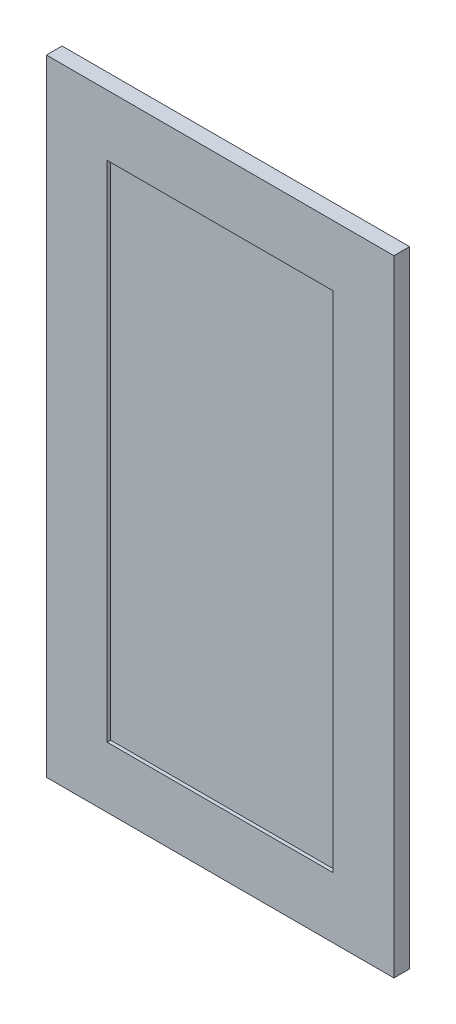
ISO-10303-21;
HEADER;
FILE_DESCRIPTION(('STEP AP214'),'2;1');
FILE_NAME('part.step','',(''),(''),'','','');
FILE_SCHEMA(('AUTOMOTIVE_DESIGN { 1 0 10303 214 1 1 1 1 }'));
ENDSEC;
DATA;
#1=APPLICATION_CONTEXT('core data for automotive mechanical design processes');
#2=APPLICATION_PROTOCOL_DEFINITION('international standard','automotive_design',2000,#1);
#3=PRODUCT_CONTEXT('',#1,'mechanical');
#4=PRODUCT('Part','Part','',(#3));
#5=PRODUCT_RELATED_PRODUCT_CATEGORY('part','',(#4));
#6=PRODUCT_DEFINITION_FORMATION('','',#4);
#7=PRODUCT_DEFINITION_CONTEXT('part definition',#1,'design');
#8=PRODUCT_DEFINITION('design','',#6,#7);
#9=PRODUCT_DEFINITION_SHAPE('','',#8);
#10=(LENGTH_UNIT() NAMED_UNIT(*) SI_UNIT(.MILLI.,.METRE.));
#11=(NAMED_UNIT(*) PLANE_ANGLE_UNIT() SI_UNIT($,.RADIAN.));
#12=(NAMED_UNIT(*) SI_UNIT($,.STERADIAN.) SOLID_ANGLE_UNIT());
#13=UNCERTAINTY_MEASURE_WITH_UNIT(LENGTH_MEASURE(1.E-05),#10,'distance_accuracy_value','');
#14=(GEOMETRIC_REPRESENTATION_CONTEXT(3) GLOBAL_UNCERTAINTY_ASSIGNED_CONTEXT((#13)) GLOBAL_UNIT_ASSIGNED_CONTEXT((#10,
#11,#12)) REPRESENTATION_CONTEXT('',''));
#15=CARTESIAN_POINT('',(0.,0.,0.));
#16=DIRECTION('',(0.,0.,1.));
#17=DIRECTION('',(1.,0.,0.));
#18=AXIS2_PLACEMENT_3D('',#15,#16,#17);
#19=CARTESIAN_POINT('',(200.,360.,18.));
#20=DIRECTION('',(-1.,0.,0.));
#21=DIRECTION('',(0.,-1.,0.));
#22=AXIS2_PLACEMENT_3D('',#19,#20,#21);
#23=PLANE('',#22);
#24=DIRECTION('',(0.,1.,0.));
#25=VECTOR('',#24,1.);
#26=CARTESIAN_POINT('',(200.,360.,0.));
#27=LINE('',#26,#25);
#28=CARTESIAN_POINT('',(200.,-360.,0.));
#29=VERTEX_POINT('',#28);
#30=CARTESIAN_POINT('',(200.,360.,0.));
#31=VERTEX_POINT('',#30);
#32=EDGE_CURVE('E141',#29,#31,#27,.T.);
#33=ORIENTED_EDGE('',*,*,#32,.T.);
#34=DIRECTION('',(0.,0.,-1.));
#35=VECTOR('',#34,1.);
#36=CARTESIAN_POINT('',(200.,360.,18.));
#37=LINE('',#36,#35);
#38=CARTESIAN_POINT('',(200.,360.,18.));
#39=VERTEX_POINT('',#38);
#40=EDGE_CURVE('E11',#39,#31,#37,.T.);
#41=ORIENTED_EDGE('',*,*,#40,.F.);
#42=DIRECTION('',(0.,1.,0.));
#43=VECTOR('',#42,1.);
#44=CARTESIAN_POINT('',(200.,360.,18.));
#45=LINE('',#44,#43);
#46=CARTESIAN_POINT('',(200.,-360.,18.));
#47=VERTEX_POINT('',#46);
#48=EDGE_CURVE('E145',#47,#39,#45,.T.);
#49=ORIENTED_EDGE('',*,*,#48,.F.);
#50=DIRECTION('',(0.,0.,-1.));
#51=VECTOR('',#50,1.);
#52=CARTESIAN_POINT('',(200.,-360.,18.));
#53=LINE('',#52,#51);
#54=EDGE_CURVE('E151',#47,#29,#53,.T.);
#55=ORIENTED_EDGE('',*,*,#54,.T.);
#56=EDGE_LOOP('',(#33,#41,#49,#55));
#57=FACE_BOUND('',#56,.T.);
#58=ADVANCED_FACE('F33',(#57),#23,.F.);
#59=CARTESIAN_POINT('',(-200.,360.,18.));
#60=DIRECTION('',(0.,-1.,0.));
#61=DIRECTION('',(0.,0.,-1.));
#62=AXIS2_PLACEMENT_3D('',#59,#60,#61);
#63=PLANE('',#62);
#64=DIRECTION('',(-1.,0.,0.));
#65=VECTOR('',#64,1.);
#66=CARTESIAN_POINT('',(-200.,360.,0.));
#67=LINE('',#66,#65);
#68=CARTESIAN_POINT('',(-200.,360.,0.));
#69=VERTEX_POINT('',#68);
#70=EDGE_CURVE('E154',#31,#69,#67,.T.);
#71=ORIENTED_EDGE('',*,*,#70,.T.);
#72=DIRECTION('',(0.,0.,-1.));
#73=VECTOR('',#72,1.);
#74=CARTESIAN_POINT('',(-200.,360.,18.));
#75=LINE('',#74,#73);
#76=CARTESIAN_POINT('',(-200.,360.,18.));
#77=VERTEX_POINT('',#76);
#78=EDGE_CURVE('E40',#77,#69,#75,.T.);
#79=ORIENTED_EDGE('',*,*,#78,.F.);
#80=DIRECTION('',(-1.,0.,0.));
#81=VECTOR('',#80,1.);
#82=CARTESIAN_POINT('',(-200.,360.,18.));
#83=LINE('',#82,#81);
#84=EDGE_CURVE('E84',#39,#77,#83,.T.);
#85=ORIENTED_EDGE('',*,*,#84,.F.);
#86=ORIENTED_EDGE('',*,*,#40,.T.);
#87=EDGE_LOOP('',(#71,#79,#85,#86));
#88=FACE_BOUND('',#87,.T.);
#89=ADVANCED_FACE('F183',(#88),#63,.F.);
#90=CARTESIAN_POINT('',(-200.,360.,18.));
#91=DIRECTION('',(1.,0.,0.));
#92=DIRECTION('',(0.,1.,0.));
#93=AXIS2_PLACEMENT_3D('',#90,#91,#92);
#94=PLANE('',#93);
#95=DIRECTION('',(0.,-1.,0.));
#96=VECTOR('',#95,1.);
#97=CARTESIAN_POINT('',(-200.,360.,0.));
#98=LINE('',#97,#96);
#99=CARTESIAN_POINT('',(-200.,-360.,0.));
#100=VERTEX_POINT('',#99);
#101=EDGE_CURVE('E156',#69,#100,#98,.T.);
#102=ORIENTED_EDGE('',*,*,#101,.T.);
#103=DIRECTION('',(0.,0.,-1.));
#104=VECTOR('',#103,1.);
#105=CARTESIAN_POINT('',(-200.,-360.,18.));
#106=LINE('',#105,#104);
#107=CARTESIAN_POINT('',(-200.,-360.,18.));
#108=VERTEX_POINT('',#107);
#109=EDGE_CURVE('E160',#108,#100,#106,.T.);
#110=ORIENTED_EDGE('',*,*,#109,.F.);
#111=DIRECTION('',(0.,-1.,0.));
#112=VECTOR('',#111,1.);
#113=CARTESIAN_POINT('',(-200.,360.,18.));
#114=LINE('',#113,#112);
#115=EDGE_CURVE('E148',#77,#108,#114,.T.);
#116=ORIENTED_EDGE('',*,*,#115,.F.);
#117=ORIENTED_EDGE('',*,*,#78,.T.);
#118=EDGE_LOOP('',(#102,#110,#116,#117));
#119=FACE_BOUND('',#118,.T.);
#120=ADVANCED_FACE('F165',(#119),#94,.F.);
#121=CARTESIAN_POINT('',(-200.,-360.,18.));
#122=DIRECTION('',(0.,1.,0.));
#123=DIRECTION('',(0.,0.,1.));
#124=AXIS2_PLACEMENT_3D('',#121,#122,#123);
#125=PLANE('',#124);
#126=DIRECTION('',(1.,0.,0.));
#127=VECTOR('',#126,1.);
#128=CARTESIAN_POINT('',(-200.,-360.,0.));
#129=LINE('',#128,#127);
#130=EDGE_CURVE('E77',#100,#29,#129,.T.);
#131=ORIENTED_EDGE('',*,*,#130,.T.);
#132=ORIENTED_EDGE('',*,*,#54,.F.);
#133=DIRECTION('',(1.,0.,0.));
#134=VECTOR('',#133,1.);
#135=CARTESIAN_POINT('',(-200.,-360.,18.));
#136=LINE('',#135,#134);
#137=EDGE_CURVE('E56',#108,#47,#136,.T.);
#138=ORIENTED_EDGE('',*,*,#137,.F.);
#139=ORIENTED_EDGE('',*,*,#109,.T.);
#140=EDGE_LOOP('',(#131,#132,#138,#139));
#141=FACE_BOUND('',#140,.T.);
#142=ADVANCED_FACE('F173',(#141),#125,.F.);
#143=CARTESIAN_POINT('',(0.,0.,18.));
#144=DIRECTION('',(0.,0.,1.));
#145=DIRECTION('',(1.,0.,0.));
#146=AXIS2_PLACEMENT_3D('',#143,#144,#145);
#147=PLANE('',#146);
#148=DIRECTION('',(0.,1.,0.));
#149=VECTOR('',#148,1.);
#150=CARTESIAN_POINT('',(130.,290.,18.));
#151=LINE('',#150,#149);
#152=CARTESIAN_POINT('',(130.,-290.,18.));
#153=VERTEX_POINT('',#152);
#154=CARTESIAN_POINT('',(130.,290.,18.));
#155=VERTEX_POINT('',#154);
#156=EDGE_CURVE('E47',#153,#155,#151,.T.);
#157=ORIENTED_EDGE('',*,*,#156,.F.);
#158=DIRECTION('',(1.,0.,0.));
#159=VECTOR('',#158,1.);
#160=CARTESIAN_POINT('',(-130.,-290.,18.));
#161=LINE('',#160,#159);
#162=CARTESIAN_POINT('',(-130.,-290.,18.));
#163=VERTEX_POINT('',#162);
#164=EDGE_CURVE('E126',#163,#153,#161,.T.);
#165=ORIENTED_EDGE('',*,*,#164,.F.);
#166=DIRECTION('',(0.,-1.,0.));
#167=VECTOR('',#166,1.);
#168=CARTESIAN_POINT('',(-130.,290.,18.));
#169=LINE('',#168,#167);
#170=CARTESIAN_POINT('',(-130.,290.,18.));
#171=VERTEX_POINT('',#170);
#172=EDGE_CURVE('E129',#171,#163,#169,.T.);
#173=ORIENTED_EDGE('',*,*,#172,.F.);
#174=DIRECTION('',(-1.,0.,0.));
#175=VECTOR('',#174,1.);
#176=CARTESIAN_POINT('',(-130.,290.,18.));
#177=LINE('',#176,#175);
#178=EDGE_CURVE('E135',#155,#171,#177,.T.);
#179=ORIENTED_EDGE('',*,*,#178,.F.);
#180=EDGE_LOOP('',(#157,#165,#173,#179));
#181=FACE_BOUND('',#180,.T.);
#182=ORIENTED_EDGE('',*,*,#48,.T.);
#183=ORIENTED_EDGE('',*,*,#84,.T.);
#184=ORIENTED_EDGE('',*,*,#115,.T.);
#185=ORIENTED_EDGE('',*,*,#137,.T.);
#186=EDGE_LOOP('',(#182,#183,#184,#185));
#187=FACE_BOUND('',#186,.T.);
#188=ADVANCED_FACE('F175',(#181,#187),#147,.T.);
#189=CARTESIAN_POINT('',(0.,0.,0.));
#190=DIRECTION('',(0.,0.,1.));
#191=DIRECTION('',(1.,0.,0.));
#192=AXIS2_PLACEMENT_3D('',#189,#190,#191);
#193=PLANE('',#192);
#194=ORIENTED_EDGE('',*,*,#32,.F.);
#195=ORIENTED_EDGE('',*,*,#130,.F.);
#196=ORIENTED_EDGE('',*,*,#101,.F.);
#197=ORIENTED_EDGE('',*,*,#70,.F.);
#198=EDGE_LOOP('',(#194,#195,#196,#197));
#199=FACE_BOUND('',#198,.T.);
#200=ADVANCED_FACE('F169',(#199),#193,.F.);
#201=CARTESIAN_POINT('',(130.,290.,14.));
#202=DIRECTION('',(1.,0.,0.));
#203=DIRECTION('',(0.,0.,-1.));
#204=AXIS2_PLACEMENT_3D('',#201,#202,#203);
#205=PLANE('',#204);
#206=ORIENTED_EDGE('',*,*,#156,.T.);
#207=DIRECTION('',(0.,0.,1.));
#208=VECTOR('',#207,1.);
#209=CARTESIAN_POINT('',(130.,290.,14.));
#210=LINE('',#209,#208);
#211=CARTESIAN_POINT('',(130.,290.,14.));
#212=VERTEX_POINT('',#211);
#213=EDGE_CURVE('E104',#212,#155,#210,.T.);
#214=ORIENTED_EDGE('',*,*,#213,.F.);
#215=DIRECTION('',(0.,1.,0.));
#216=VECTOR('',#215,1.);
#217=CARTESIAN_POINT('',(130.,290.,14.));
#218=LINE('',#217,#216);
#219=CARTESIAN_POINT('',(130.,-290.,14.));
#220=VERTEX_POINT('',#219);
#221=EDGE_CURVE('E108',#220,#212,#218,.T.);
#222=ORIENTED_EDGE('',*,*,#221,.F.);
#223=DIRECTION('',(0.,0.,1.));
#224=VECTOR('',#223,1.);
#225=CARTESIAN_POINT('',(130.,-290.,14.));
#226=LINE('',#225,#224);
#227=EDGE_CURVE('E139',#220,#153,#226,.T.);
#228=ORIENTED_EDGE('',*,*,#227,.T.);
#229=EDGE_LOOP('',(#206,#214,#222,#228));
#230=FACE_BOUND('',#229,.T.);
#231=ADVANCED_FACE('F106',(#230),#205,.F.);
#232=CARTESIAN_POINT('',(-130.,-290.,14.));
#233=DIRECTION('',(0.,-1.,0.));
#234=DIRECTION('',(0.,0.,-1.));
#235=AXIS2_PLACEMENT_3D('',#232,#233,#234);
#236=PLANE('',#235);
#237=ORIENTED_EDGE('',*,*,#164,.T.);
#238=ORIENTED_EDGE('',*,*,#227,.F.);
#239=DIRECTION('',(1.,0.,0.));
#240=VECTOR('',#239,1.);
#241=CARTESIAN_POINT('',(-130.,-290.,14.));
#242=LINE('',#241,#240);
#243=CARTESIAN_POINT('',(-130.,-290.,14.));
#244=VERTEX_POINT('',#243);
#245=EDGE_CURVE('E114',#244,#220,#242,.T.);
#246=ORIENTED_EDGE('',*,*,#245,.F.);
#247=DIRECTION('',(0.,0.,1.));
#248=VECTOR('',#247,1.);
#249=CARTESIAN_POINT('',(-130.,-290.,14.));
#250=LINE('',#249,#248);
#251=EDGE_CURVE('E142',#244,#163,#250,.T.);
#252=ORIENTED_EDGE('',*,*,#251,.T.);
#253=EDGE_LOOP('',(#237,#238,#246,#252));
#254=FACE_BOUND('',#253,.T.);
#255=ADVANCED_FACE('F222',(#254),#236,.F.);
#256=CARTESIAN_POINT('',(-130.,290.,14.));
#257=DIRECTION('',(-1.,0.,0.));
#258=DIRECTION('',(0.,0.,1.));
#259=AXIS2_PLACEMENT_3D('',#256,#257,#258);
#260=PLANE('',#259);
#261=ORIENTED_EDGE('',*,*,#172,.T.);
#262=ORIENTED_EDGE('',*,*,#251,.F.);
#263=DIRECTION('',(0.,-1.,0.));
#264=VECTOR('',#263,1.);
#265=CARTESIAN_POINT('',(-130.,290.,14.));
#266=LINE('',#265,#264);
#267=CARTESIAN_POINT('',(-130.,290.,14.));
#268=VERTEX_POINT('',#267);
#269=EDGE_CURVE('E122',#268,#244,#266,.T.);
#270=ORIENTED_EDGE('',*,*,#269,.F.);
#271=DIRECTION('',(0.,0.,1.));
#272=VECTOR('',#271,1.);
#273=CARTESIAN_POINT('',(-130.,290.,14.));
#274=LINE('',#273,#272);
#275=EDGE_CURVE('E113',#268,#171,#274,.T.);
#276=ORIENTED_EDGE('',*,*,#275,.T.);
#277=EDGE_LOOP('',(#261,#262,#270,#276));
#278=FACE_BOUND('',#277,.T.);
#279=ADVANCED_FACE('F231',(#278),#260,.F.);
#280=CARTESIAN_POINT('',(-130.,290.,14.));
#281=DIRECTION('',(0.,1.,0.));
#282=DIRECTION('',(0.,0.,1.));
#283=AXIS2_PLACEMENT_3D('',#280,#281,#282);
#284=PLANE('',#283);
#285=ORIENTED_EDGE('',*,*,#178,.T.);
#286=ORIENTED_EDGE('',*,*,#275,.F.);
#287=DIRECTION('',(-1.,0.,0.));
#288=VECTOR('',#287,1.);
#289=CARTESIAN_POINT('',(-130.,290.,14.));
#290=LINE('',#289,#288);
#291=EDGE_CURVE('E117',#212,#268,#290,.T.);
#292=ORIENTED_EDGE('',*,*,#291,.F.);
#293=ORIENTED_EDGE('',*,*,#213,.T.);
#294=EDGE_LOOP('',(#285,#286,#292,#293));
#295=FACE_BOUND('',#294,.T.);
#296=ADVANCED_FACE('F118',(#295),#284,.F.);
#297=CARTESIAN_POINT('',(0.,0.,14.));
#298=DIRECTION('',(0.,0.,1.));
#299=DIRECTION('',(1.,0.,0.));
#300=AXIS2_PLACEMENT_3D('',#297,#298,#299);
#301=PLANE('',#300);
#302=ORIENTED_EDGE('',*,*,#221,.T.);
#303=ORIENTED_EDGE('',*,*,#291,.T.);
#304=ORIENTED_EDGE('',*,*,#269,.T.);
#305=ORIENTED_EDGE('',*,*,#245,.T.);
#306=EDGE_LOOP('',(#302,#303,#304,#305));
#307=FACE_BOUND('',#306,.T.);
#308=ADVANCED_FACE('F124',(#307),#301,.T.);
#309=CLOSED_SHELL('',(#58,#89,#120,#142,#188,#200,#231,#255,#279,#296,#308));
#310=MANIFOLD_SOLID_BREP('B2',#309);
#311=ADVANCED_BREP_SHAPE_REPRESENTATION('',(#18,#310),#14);
#312=SHAPE_DEFINITION_REPRESENTATION(#9,#311);
ENDSEC;
END-ISO-10303-21;
